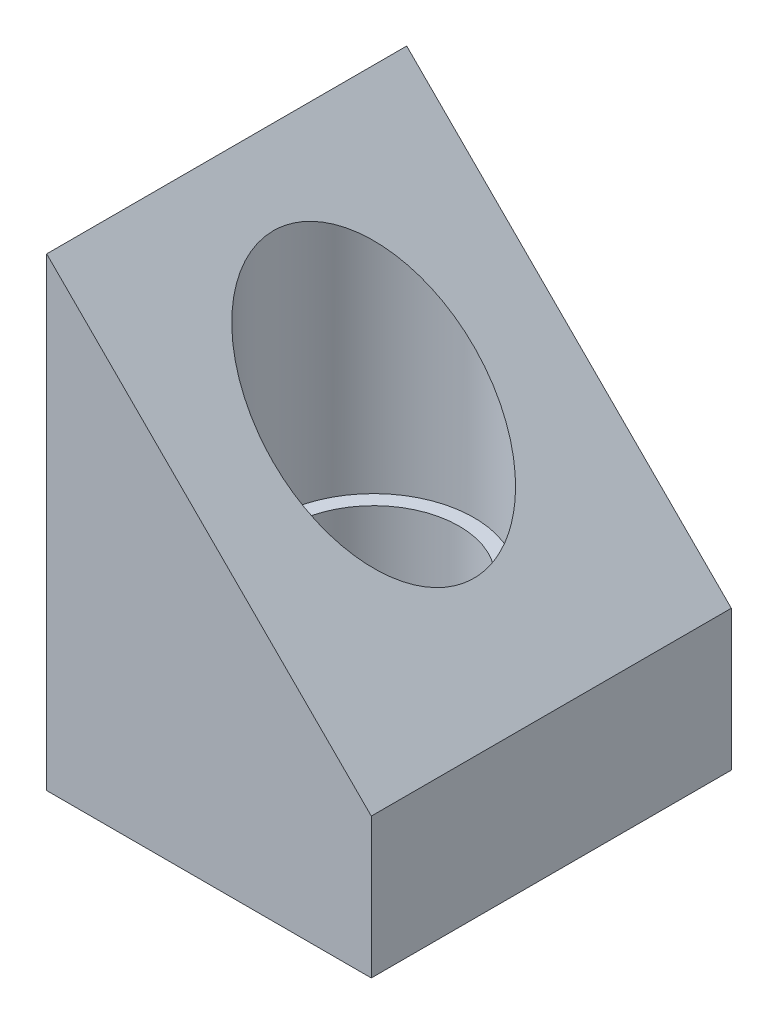
ISO-10303-21;
HEADER;
FILE_DESCRIPTION(('STEP AP214'),'2;1');
FILE_NAME('part.step','',(''),(''),'','','');
FILE_SCHEMA(('AUTOMOTIVE_DESIGN { 1 0 10303 214 1 1 1 1 }'));
ENDSEC;
DATA;
#1=APPLICATION_CONTEXT('core data for automotive mechanical design processes');
#2=APPLICATION_PROTOCOL_DEFINITION('international standard','automotive_design',2000,#1);
#3=PRODUCT_CONTEXT('',#1,'mechanical');
#4=PRODUCT('Part','Part','',(#3));
#5=PRODUCT_RELATED_PRODUCT_CATEGORY('part','',(#4));
#6=PRODUCT_DEFINITION_FORMATION('','',#4);
#7=PRODUCT_DEFINITION_CONTEXT('part definition',#1,'design');
#8=PRODUCT_DEFINITION('design','',#6,#7);
#9=PRODUCT_DEFINITION_SHAPE('','',#8);
#10=(LENGTH_UNIT() NAMED_UNIT(*) SI_UNIT(.MILLI.,.METRE.));
#11=(NAMED_UNIT(*) PLANE_ANGLE_UNIT() SI_UNIT($,.RADIAN.));
#12=(NAMED_UNIT(*) SI_UNIT($,.STERADIAN.) SOLID_ANGLE_UNIT());
#13=UNCERTAINTY_MEASURE_WITH_UNIT(LENGTH_MEASURE(1.E-05),#10,'distance_accuracy_value','');
#14=(GEOMETRIC_REPRESENTATION_CONTEXT(3) GLOBAL_UNCERTAINTY_ASSIGNED_CONTEXT((#13)) GLOBAL_UNIT_ASSIGNED_CONTEXT((#10,
#11,#12)) REPRESENTATION_CONTEXT('',''));
#15=CARTESIAN_POINT('',(0.,0.,0.));
#16=DIRECTION('',(0.,0.,1.));
#17=DIRECTION('',(1.,0.,0.));
#18=AXIS2_PLACEMENT_3D('',#15,#16,#17);
#19=CARTESIAN_POINT('',(12.75,-12.3,55.6));
#20=DIRECTION('',(1.,0.,0.));
#21=DIRECTION('',(0.,0.,-1.));
#22=AXIS2_PLACEMENT_3D('',#19,#20,#21);
#23=PLANE('',#22);
#24=DIRECTION('',(0.,0.,1.));
#25=VECTOR('',#24,1.);
#26=CARTESIAN_POINT('',(12.75,-13.3,55.6));
#27=LINE('',#26,#25);
#28=CARTESIAN_POINT('',(12.75,-13.3,49.5));
#29=VERTEX_POINT('',#28);
#30=CARTESIAN_POINT('',(12.75,-13.3,55.6));
#31=VERTEX_POINT('',#30);
#32=EDGE_CURVE('E98',#29,#31,#27,.T.);
#33=ORIENTED_EDGE('',*,*,#32,.T.);
#34=DIRECTION('',(0.,-1.,0.));
#35=VECTOR('',#34,1.);
#36=CARTESIAN_POINT('',(12.75,-12.3,55.6));
#37=LINE('',#36,#35);
#38=CARTESIAN_POINT('',(12.75,-5.42426406871189,55.6));
#39=VERTEX_POINT('',#38);
#40=EDGE_CURVE('E48',#39,#31,#37,.T.);
#41=ORIENTED_EDGE('',*,*,#40,.F.);
#42=DIRECTION('',(0.,0.,1.));
#43=VECTOR('',#42,1.);
#44=CARTESIAN_POINT('',(12.75,-5.42426406871189,49.5));
#45=LINE('',#44,#43);
#46=CARTESIAN_POINT('',(12.75,-5.42426406871189,49.5));
#47=VERTEX_POINT('',#46);
#48=EDGE_CURVE('E99',#47,#39,#45,.T.);
#49=ORIENTED_EDGE('',*,*,#48,.F.);
#50=DIRECTION('',(0.,-1.,0.));
#51=VECTOR('',#50,1.);
#52=CARTESIAN_POINT('',(12.75,-12.3,49.5));
#53=LINE('',#52,#51);
#54=EDGE_CURVE('E89',#47,#29,#53,.T.);
#55=ORIENTED_EDGE('',*,*,#54,.T.);
#56=EDGE_LOOP('',(#33,#41,#49,#55));
#57=FACE_BOUND('',#56,.T.);
#58=ADVANCED_FACE('F39',(#57),#23,.F.);
#59=CARTESIAN_POINT('',(18.25,-12.3,55.6));
#60=DIRECTION('',(0.,0.,-1.));
#61=DIRECTION('',(-1.,0.,0.));
#62=AXIS2_PLACEMENT_3D('',#59,#60,#61);
#63=PLANE('',#62);
#64=DIRECTION('',(1.,0.,0.));
#65=VECTOR('',#64,1.);
#66=CARTESIAN_POINT('',(18.25,-13.3,55.6));
#67=LINE('',#66,#65);
#68=CARTESIAN_POINT('',(18.25,-13.3,55.6));
#69=VERTEX_POINT('',#68);
#70=EDGE_CURVE('E119',#31,#69,#67,.T.);
#71=ORIENTED_EDGE('',*,*,#70,.T.);
#72=DIRECTION('',(0.,-1.,0.));
#73=VECTOR('',#72,1.);
#74=CARTESIAN_POINT('',(18.25,-12.3,55.6));
#75=LINE('',#74,#73);
#76=CARTESIAN_POINT('',(18.25,-10.924264068712,55.6));
#77=VERTEX_POINT('',#76);
#78=EDGE_CURVE('E88',#77,#69,#75,.T.);
#79=ORIENTED_EDGE('',*,*,#78,.F.);
#80=DIRECTION('',(0.707106781186543,-0.707106781186552,0.));
#81=VECTOR('',#80,1.);
#82=CARTESIAN_POINT('',(9.01777236101558,-1.69203642972741,55.6));
#83=LINE('',#82,#81);
#84=EDGE_CURVE('E103',#39,#77,#83,.T.);
#85=ORIENTED_EDGE('',*,*,#84,.F.);
#86=ORIENTED_EDGE('',*,*,#40,.T.);
#87=EDGE_LOOP('',(#71,#79,#85,#86));
#88=FACE_BOUND('',#87,.T.);
#89=ADVANCED_FACE('F156',(#88),#63,.F.);
#90=CARTESIAN_POINT('',(18.25,-12.3,55.6));
#91=DIRECTION('',(-1.,0.,0.));
#92=DIRECTION('',(0.,0.,1.));
#93=AXIS2_PLACEMENT_3D('',#90,#91,#92);
#94=PLANE('',#93);
#95=DIRECTION('',(0.,0.,-1.));
#96=VECTOR('',#95,1.);
#97=CARTESIAN_POINT('',(18.25,-13.3,55.6));
#98=LINE('',#97,#96);
#99=CARTESIAN_POINT('',(18.25,-13.3,49.5));
#100=VERTEX_POINT('',#99);
#101=EDGE_CURVE('E64',#69,#100,#98,.T.);
#102=ORIENTED_EDGE('',*,*,#101,.T.);
#103=DIRECTION('',(0.,-1.,0.));
#104=VECTOR('',#103,1.);
#105=CARTESIAN_POINT('',(18.25,-12.3,49.5));
#106=LINE('',#105,#104);
#107=CARTESIAN_POINT('',(18.25,-10.924264068712,49.5));
#108=VERTEX_POINT('',#107);
#109=EDGE_CURVE('E81',#108,#100,#106,.T.);
#110=ORIENTED_EDGE('',*,*,#109,.F.);
#111=DIRECTION('',(0.,0.,-1.));
#112=VECTOR('',#111,1.);
#113=CARTESIAN_POINT('',(18.25,-10.924264068712,55.6));
#114=LINE('',#113,#112);
#115=EDGE_CURVE('E85',#77,#108,#114,.T.);
#116=ORIENTED_EDGE('',*,*,#115,.F.);
#117=ORIENTED_EDGE('',*,*,#78,.T.);
#118=EDGE_LOOP('',(#102,#110,#116,#117));
#119=FACE_BOUND('',#118,.T.);
#120=ADVANCED_FACE('F83',(#119),#94,.F.);
#121=CARTESIAN_POINT('',(18.25,-12.3,49.5));
#122=DIRECTION('',(0.,0.,1.));
#123=DIRECTION('',(1.,0.,0.));
#124=AXIS2_PLACEMENT_3D('',#121,#122,#123);
#125=PLANE('',#124);
#126=DIRECTION('',(-1.,0.,0.));
#127=VECTOR('',#126,1.);
#128=CARTESIAN_POINT('',(18.25,-13.3,49.5));
#129=LINE('',#128,#127);
#130=EDGE_CURVE('E56',#100,#29,#129,.T.);
#131=ORIENTED_EDGE('',*,*,#130,.T.);
#132=ORIENTED_EDGE('',*,*,#54,.F.);
#133=DIRECTION('',(-0.707106781186543,0.707106781186552,0.));
#134=VECTOR('',#133,1.);
#135=CARTESIAN_POINT('',(11.7677723610156,-4.44203642972742,49.5));
#136=LINE('',#135,#134);
#137=EDGE_CURVE('E92',#108,#47,#136,.T.);
#138=ORIENTED_EDGE('',*,*,#137,.F.);
#139=ORIENTED_EDGE('',*,*,#109,.T.);
#140=EDGE_LOOP('',(#131,#132,#138,#139));
#141=FACE_BOUND('',#140,.T.);
#142=ADVANCED_FACE('F93',(#141),#125,.F.);
#143=CARTESIAN_POINT('',(0.,-13.3,0.));
#144=DIRECTION('',(0.,1.,0.));
#145=DIRECTION('',(0.,0.,1.));
#146=AXIS2_PLACEMENT_3D('',#143,#144,#145);
#147=PLANE('',#146);
#148=ORIENTED_EDGE('',*,*,#32,.F.);
#149=ORIENTED_EDGE('',*,*,#130,.F.);
#150=ORIENTED_EDGE('',*,*,#101,.F.);
#151=ORIENTED_EDGE('',*,*,#70,.F.);
#152=EDGE_LOOP('',(#148,#149,#150,#151));
#153=FACE_BOUND('',#152,.T.);
#154=ADVANCED_FACE('F152',(#153),#147,.F.);
#155=CARTESIAN_POINT('',(18.287867965644,-10.962132034356,-41.2560601609024));
#156=DIRECTION('',(0.707106781186552,0.707106781186543,0.));
#157=DIRECTION('',(0.,0.,-1.));
#158=AXIS2_PLACEMENT_3D('',#155,#156,#157);
#159=PLANE('',#158);
#160=CARTESIAN_POINT('',(15.24,-7.91426406871193,52.55));
#161=DIRECTION('',(0.707106781186552,0.707106781186543,0.));
#162=DIRECTION('',(-0.707106781186543,0.707106781186552,0.));
#163=AXIS2_PLACEMENT_3D('',#160,#161,#162);
#164=ELLIPSE('',#163,2.40416305603428,1.7);
#165=CARTESIAN_POINT('',(13.54,-6.21426406871191,52.55));
#166=VERTEX_POINT('',#165);
#167=EDGE_CURVE('E111',#166,#166,#164,.T.);
#168=ORIENTED_EDGE('',*,*,#167,.F.);
#169=EDGE_LOOP('',(#168));
#170=FACE_BOUND('',#169,.T.);
#171=ORIENTED_EDGE('',*,*,#115,.T.);
#172=ORIENTED_EDGE('',*,*,#137,.T.);
#173=ORIENTED_EDGE('',*,*,#48,.T.);
#174=ORIENTED_EDGE('',*,*,#84,.T.);
#175=EDGE_LOOP('',(#171,#172,#173,#174));
#176=FACE_BOUND('',#175,.T.);
#177=ADVANCED_FACE('F101',(#170,#176),#159,.T.);
#178=CARTESIAN_POINT('',(15.24,-10.4242640687119,52.55));
#179=DIRECTION('',(0.,1.,0.));
#180=DIRECTION('',(0.,0.,1.));
#181=AXIS2_PLACEMENT_3D('',#178,#179,#180);
#182=CYLINDRICAL_SURFACE('',#181,1.7);
#183=ORIENTED_EDGE('',*,*,#167,.T.);
#184=EDGE_LOOP('',(#183));
#185=FACE_BOUND('',#184,.T.);
#186=CARTESIAN_POINT('',(15.24,-10.4242640687119,52.55));
#187=DIRECTION('',(0.,1.,0.));
#188=DIRECTION('',(0.,0.,1.));
#189=AXIS2_PLACEMENT_3D('',#186,#187,#188);
#190=CIRCLE('',#189,1.7);
#191=CARTESIAN_POINT('',(15.24,-10.4242640687119,54.25));
#192=VERTEX_POINT('',#191);
#193=EDGE_CURVE('E113',#192,#192,#190,.T.);
#194=ORIENTED_EDGE('',*,*,#193,.F.);
#195=EDGE_LOOP('',(#194));
#196=FACE_BOUND('',#195,.T.);
#197=ADVANCED_FACE('F142',(#185,#196),#182,.F.);
#198=CARTESIAN_POINT('',(15.24,-10.4242640687119,52.55));
#199=DIRECTION('',(0.,1.,0.));
#200=DIRECTION('',(0.,0.,1.));
#201=AXIS2_PLACEMENT_3D('',#198,#199,#200);
#202=PLANE('',#201);
#203=CARTESIAN_POINT('',(15.24,-10.4242640687119,52.55));
#204=DIRECTION('',(0.,1.,0.));
#205=DIRECTION('',(0.,0.,1.));
#206=AXIS2_PLACEMENT_3D('',#203,#204,#205);
#207=CIRCLE('',#206,1.45);
#208=CARTESIAN_POINT('',(15.24,-10.4242640687119,51.1));
#209=VERTEX_POINT('',#208);
#210=EDGE_CURVE('E42',#209,#209,#207,.T.);
#211=ORIENTED_EDGE('',*,*,#210,.F.);
#212=EDGE_LOOP('',(#211));
#213=FACE_BOUND('',#212,.T.);
#214=ORIENTED_EDGE('',*,*,#193,.T.);
#215=EDGE_LOOP('',(#214));
#216=FACE_BOUND('',#215,.T.);
#217=ADVANCED_FACE('F140',(#213,#216),#202,.T.);
#218=CARTESIAN_POINT('',(0.,-12.3,0.));
#219=DIRECTION('',(0.,1.,0.));
#220=DIRECTION('',(0.,0.,1.));
#221=AXIS2_PLACEMENT_3D('',#218,#219,#220);
#222=PLANE('',#221);
#223=CARTESIAN_POINT('',(15.24,-12.3,52.55));
#224=DIRECTION('',(0.,1.,0.));
#225=DIRECTION('',(0.,0.,1.));
#226=AXIS2_PLACEMENT_3D('',#223,#224,#225);
#227=CIRCLE('',#226,1.45);
#228=CARTESIAN_POINT('',(15.24,-12.3,51.1));
#229=VERTEX_POINT('',#228);
#230=EDGE_CURVE('E12',#229,#229,#227,.F.);
#231=ORIENTED_EDGE('',*,*,#230,.F.);
#232=EDGE_LOOP('',(#231));
#233=FACE_BOUND('',#232,.T.);
#234=ADVANCED_FACE('F149',(#233),#222,.T.);
#235=CARTESIAN_POINT('',(15.24,2.04019120925696,52.55));
#236=DIRECTION('',(0.,-1.,0.));
#237=DIRECTION('',(0.,0.,-1.));
#238=AXIS2_PLACEMENT_3D('',#235,#236,#237);
#239=CYLINDRICAL_SURFACE('',#238,1.45);
#240=CARTESIAN_POINT('',(15.24,-12.3,51.1));
#241=CARTESIAN_POINT('',(15.24,-12.2804610840491,51.1));
#242=CARTESIAN_POINT('',(15.24,-12.2609221680982,51.1));
#243=CARTESIAN_POINT('',(15.24,-12.2218443361963,51.1));
#244=CARTESIAN_POINT('',(15.24,-12.2023054202454,51.1));
#245=CARTESIAN_POINT('',(15.24,-12.1632275883436,51.1));
#246=CARTESIAN_POINT('',(15.24,-12.1436886723927,51.1));
#247=CARTESIAN_POINT('',(15.24,-12.1046108404908,51.1));
#248=CARTESIAN_POINT('',(15.24,-12.0850719245399,51.1));
#249=CARTESIAN_POINT('',(15.24,-12.0459940926381,51.1));
#250=CARTESIAN_POINT('',(15.24,-12.0264551766872,51.1));
#251=CARTESIAN_POINT('',(15.24,-11.9873773447853,51.1));
#252=CARTESIAN_POINT('',(15.24,-11.9678384288344,51.1));
#253=CARTESIAN_POINT('',(15.24,-11.9287605969326,51.1));
#254=CARTESIAN_POINT('',(15.24,-11.9092216809816,51.1));
#255=CARTESIAN_POINT('',(15.24,-11.8701438490798,51.1));
#256=CARTESIAN_POINT('',(15.24,-11.8506049331289,51.1));
#257=CARTESIAN_POINT('',(15.24,-11.8115271012271,51.1));
#258=CARTESIAN_POINT('',(15.24,-11.7919881852761,51.1));
#259=CARTESIAN_POINT('',(15.24,-11.7529103533743,51.1));
#260=CARTESIAN_POINT('',(15.24,-11.7333714374234,51.1));
#261=CARTESIAN_POINT('',(15.24,-11.6942936055215,51.1));
#262=CARTESIAN_POINT('',(15.24,-11.6747546895706,51.1));
#263=CARTESIAN_POINT('',(15.24,-11.6356768576688,51.1));
#264=CARTESIAN_POINT('',(15.24,-11.6161379417179,51.1));
#265=CARTESIAN_POINT('',(15.24,-11.577060109816,51.1));
#266=CARTESIAN_POINT('',(15.24,-11.5575211938651,51.1));
#267=CARTESIAN_POINT('',(15.24,-11.5184433619633,51.1));
#268=CARTESIAN_POINT('',(15.24,-11.4989044460124,51.1));
#269=CARTESIAN_POINT('',(15.24,-11.4598266141105,51.1));
#270=CARTESIAN_POINT('',(15.24,-11.4402876981596,51.1));
#271=CARTESIAN_POINT('',(15.24,-11.4012098662578,51.1));
#272=CARTESIAN_POINT('',(15.24,-11.3816709503069,51.1));
#273=CARTESIAN_POINT('',(15.24,-11.342593118405,51.1));
#274=CARTESIAN_POINT('',(15.24,-11.3230542024541,51.1));
#275=CARTESIAN_POINT('',(15.24,-11.2839763705523,51.1));
#276=CARTESIAN_POINT('',(15.24,-11.2644374546014,51.1));
#277=CARTESIAN_POINT('',(15.24,-11.2253596226995,51.1));
#278=CARTESIAN_POINT('',(15.24,-11.2058207067486,51.1));
#279=CARTESIAN_POINT('',(15.24,-11.1667428748468,51.1));
#280=CARTESIAN_POINT('',(15.24,-11.1472039588958,51.1));
#281=CARTESIAN_POINT('',(15.24,-11.108126126994,51.1));
#282=CARTESIAN_POINT('',(15.24,-11.0885872110431,51.1));
#283=CARTESIAN_POINT('',(15.24,-11.0495093791413,51.1));
#284=CARTESIAN_POINT('',(15.24,-11.0299704631903,51.1));
#285=CARTESIAN_POINT('',(15.24,-10.9908926312885,51.1));
#286=CARTESIAN_POINT('',(15.24,-10.9713537153376,51.1));
#287=CARTESIAN_POINT('',(15.24,-10.9322758834358,51.1));
#288=CARTESIAN_POINT('',(15.24,-10.9127369674848,51.1));
#289=CARTESIAN_POINT('',(15.24,-10.873659135583,51.1));
#290=CARTESIAN_POINT('',(15.24,-10.8541202196321,51.1));
#291=CARTESIAN_POINT('',(15.24,-10.8150423877302,51.1));
#292=CARTESIAN_POINT('',(15.24,-10.7955034717793,51.1));
#293=CARTESIAN_POINT('',(15.24,-10.7564256398775,51.1));
#294=CARTESIAN_POINT('',(15.24,-10.7368867239266,51.1));
#295=CARTESIAN_POINT('',(15.24,-10.6978088920247,51.1));
#296=CARTESIAN_POINT('',(15.24,-10.6782699760738,51.1));
#297=CARTESIAN_POINT('',(15.24,-10.639192144172,51.1));
#298=CARTESIAN_POINT('',(15.24,-10.6196532282211,51.1));
#299=CARTESIAN_POINT('',(15.24,-10.5805753963192,51.1));
#300=CARTESIAN_POINT('',(15.24,-10.5610364803683,51.1));
#301=CARTESIAN_POINT('',(15.24,-10.5219586484665,51.1));
#302=CARTESIAN_POINT('',(15.24,-10.5024197325156,51.1));
#303=CARTESIAN_POINT('',(15.24,-10.4633419006137,51.1));
#304=CARTESIAN_POINT('',(15.24,-10.4438029846628,51.1));
#305=CARTESIAN_POINT('',(15.24,-10.4242640687119,51.1));
#306=B_SPLINE_CURVE_WITH_KNOTS('',3,(#240,#241,#242,#243,#244,#245,#246,#247,#248,#249,#250,
#251,#252,#253,#254,#255,#256,#257,#258,#259,#260,#261,#262,#263,#264,#265,#266,#267,#268,#269,
#270,#271,#272,#273,#274,#275,#276,#277,#278,#279,#280,#281,#282,#283,#284,#285,#286,#287,#288,
#289,#290,#291,#292,#293,#294,#295,#296,#297,#298,#299,#300,#301,#302,#303,#304,#305),
.UNSPECIFIED.,.F.,.F.,(4,2,2,2,2,2,2,2,2,2,2,2,2,2,2,2,2,2,2,2,2,2,2,2,2,2,2,2,2,2,2,2,4),(0.,
0.0586167478527529,0.117233495705507,0.17585024355826,0.234466991411015,0.293083739263768,
0.351700487116521,0.410317234969275,0.468933982822028,0.527550730674781,0.586167478527536,
0.644784226380288,0.703400974233041,0.762017722085796,0.820634469938549,0.879251217791303,
0.937867965644056,0.996484713496809,1.05510146134956,1.11371820920232,1.17233495705507,
1.23095170490782,1.28956845276058,1.34818520061333,1.40680194846608,1.46541869631884,
1.52403544417159,1.58265219202434,1.6412689398771,1.69988568772985,1.75850243558261,
1.81711918343536,1.87573593128811),.UNSPECIFIED.);
#307=EDGE_CURVE('BSEAM206',#229,#209,#306,.T.);
#308=ORIENTED_EDGE('',*,*,#230,.T.);
#309=ORIENTED_EDGE('',*,*,#210,.T.);
#310=ORIENTED_EDGE('',*,*,#307,.T.);
#311=ORIENTED_EDGE('',*,*,#307,.F.);
#312=EDGE_LOOP('',(#308,#310,#309,#311));
#313=FACE_BOUND('',#312,.T.);
#314=ADVANCED_FACE('F206',(#313),#239,.F.);
#315=CLOSED_SHELL('',(#58,#89,#120,#142,#154,#177,#197,#217,#234,#314));
#316=MANIFOLD_SOLID_BREP('B2',#315);
#317=ADVANCED_BREP_SHAPE_REPRESENTATION('',(#18,#316),#14);
#318=SHAPE_DEFINITION_REPRESENTATION(#9,#317);
ENDSEC;
END-ISO-10303-21;
